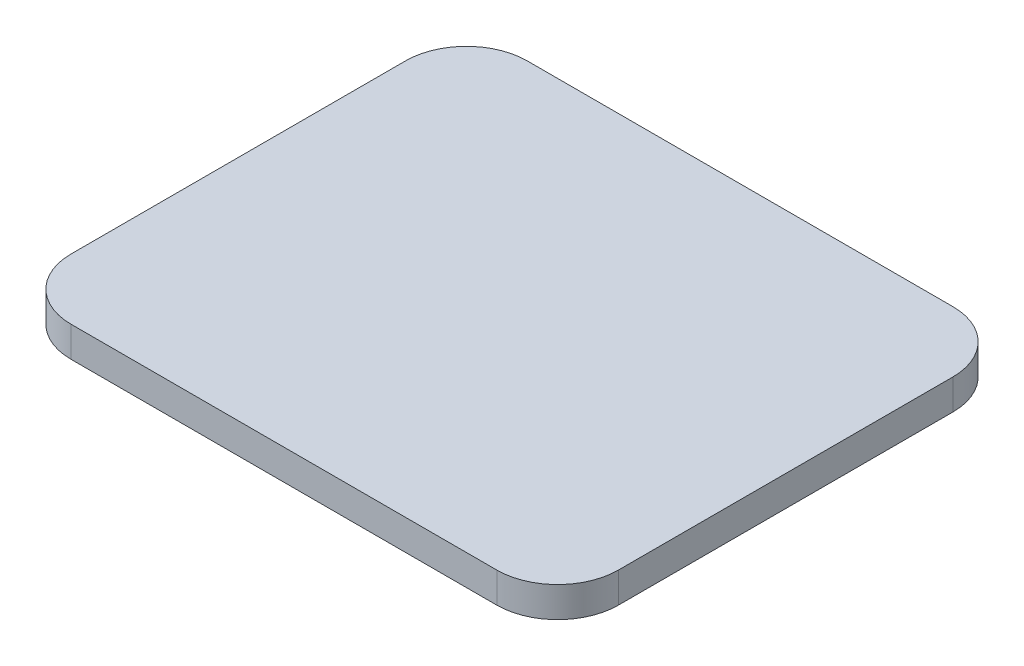
ISO-10303-21;
HEADER;
FILE_DESCRIPTION(('STEP AP214'),'2;1');
FILE_NAME('part.step','',(''),(''),'','','');
FILE_SCHEMA(('AUTOMOTIVE_DESIGN { 1 0 10303 214 1 1 1 1 }'));
ENDSEC;
DATA;
#1=APPLICATION_CONTEXT('core data for automotive mechanical design processes');
#2=APPLICATION_PROTOCOL_DEFINITION('international standard','automotive_design',2000,#1);
#3=PRODUCT_CONTEXT('',#1,'mechanical');
#4=PRODUCT('Part','Part','',(#3));
#5=PRODUCT_RELATED_PRODUCT_CATEGORY('part','',(#4));
#6=PRODUCT_DEFINITION_FORMATION('','',#4);
#7=PRODUCT_DEFINITION_CONTEXT('part definition',#1,'design');
#8=PRODUCT_DEFINITION('design','',#6,#7);
#9=PRODUCT_DEFINITION_SHAPE('','',#8);
#10=(LENGTH_UNIT() NAMED_UNIT(*) SI_UNIT(.MILLI.,.METRE.));
#11=(NAMED_UNIT(*) PLANE_ANGLE_UNIT() SI_UNIT($,.RADIAN.));
#12=(NAMED_UNIT(*) SI_UNIT($,.STERADIAN.) SOLID_ANGLE_UNIT());
#13=UNCERTAINTY_MEASURE_WITH_UNIT(LENGTH_MEASURE(1.E-05),#10,'distance_accuracy_value','');
#14=(GEOMETRIC_REPRESENTATION_CONTEXT(3) GLOBAL_UNCERTAINTY_ASSIGNED_CONTEXT((#13)) GLOBAL_UNIT_ASSIGNED_CONTEXT((#10,
#11,#12)) REPRESENTATION_CONTEXT('',''));
#15=CARTESIAN_POINT('',(0.,0.,0.));
#16=DIRECTION('',(0.,0.,1.));
#17=DIRECTION('',(1.,0.,0.));
#18=AXIS2_PLACEMENT_3D('',#15,#16,#17);
#19=CARTESIAN_POINT('',(2.,1.,-13.));
#20=DIRECTION('',(0.,-1.,0.));
#21=DIRECTION('',(0.,0.,-1.));
#22=AXIS2_PLACEMENT_3D('',#19,#20,#21);
#23=CYLINDRICAL_SURFACE('',#22,2.);
#24=CARTESIAN_POINT('',(2.,0.,-13.));
#25=DIRECTION('',(0.,1.,0.));
#26=DIRECTION('',(0.,0.,1.));
#27=AXIS2_PLACEMENT_3D('',#24,#25,#26);
#28=CIRCLE('',#27,2.);
#29=CARTESIAN_POINT('',(2.00000000000001,0.,-15.));
#30=VERTEX_POINT('',#29);
#31=CARTESIAN_POINT('',(0.,0.,-13.));
#32=VERTEX_POINT('',#31);
#33=EDGE_CURVE('E134',#30,#32,#28,.T.);
#34=ORIENTED_EDGE('',*,*,#33,.T.);
#35=DIRECTION('',(0.,-1.,0.));
#36=VECTOR('',#35,1.);
#37=CARTESIAN_POINT('',(0.,1.,-13.));
#38=LINE('',#37,#36);
#39=CARTESIAN_POINT('',(0.,1.,-13.));
#40=VERTEX_POINT('',#39);
#41=EDGE_CURVE('E11',#40,#32,#38,.T.);
#42=ORIENTED_EDGE('',*,*,#41,.F.);
#43=CARTESIAN_POINT('',(2.,1.,-13.));
#44=DIRECTION('',(0.,1.,0.));
#45=DIRECTION('',(0.,0.,1.));
#46=AXIS2_PLACEMENT_3D('',#43,#44,#45);
#47=CIRCLE('',#46,2.);
#48=CARTESIAN_POINT('',(2.00000000000001,1.,-15.));
#49=VERTEX_POINT('',#48);
#50=EDGE_CURVE('E146',#49,#40,#47,.T.);
#51=ORIENTED_EDGE('',*,*,#50,.F.);
#52=DIRECTION('',(0.,-1.,0.));
#53=VECTOR('',#52,1.);
#54=CARTESIAN_POINT('',(2.00000000000001,1.,-15.));
#55=LINE('',#54,#53);
#56=EDGE_CURVE('E131',#49,#30,#55,.T.);
#57=ORIENTED_EDGE('',*,*,#56,.T.);
#58=EDGE_LOOP('',(#34,#42,#51,#57));
#59=FACE_BOUND('',#58,.T.);
#60=ADVANCED_FACE('F39',(#59),#23,.T.);
#61=CARTESIAN_POINT('',(0.,1.,-2.00000000000001));
#62=DIRECTION('',(1.,0.,0.));
#63=DIRECTION('',(0.,0.,-1.));
#64=AXIS2_PLACEMENT_3D('',#61,#62,#63);
#65=PLANE('',#64);
#66=DIRECTION('',(0.,0.,1.));
#67=VECTOR('',#66,1.);
#68=CARTESIAN_POINT('',(0.,0.,-2.00000000000001));
#69=LINE('',#68,#67);
#70=CARTESIAN_POINT('',(0.,0.,-2.00000000000001));
#71=VERTEX_POINT('',#70);
#72=EDGE_CURVE('E138',#32,#71,#69,.T.);
#73=ORIENTED_EDGE('',*,*,#72,.T.);
#74=DIRECTION('',(0.,-1.,0.));
#75=VECTOR('',#74,1.);
#76=CARTESIAN_POINT('',(0.,1.,-2.00000000000001));
#77=LINE('',#76,#75);
#78=CARTESIAN_POINT('',(0.,1.,-2.00000000000001));
#79=VERTEX_POINT('',#78);
#80=EDGE_CURVE('E50',#79,#71,#77,.T.);
#81=ORIENTED_EDGE('',*,*,#80,.F.);
#82=DIRECTION('',(0.,0.,1.));
#83=VECTOR('',#82,1.);
#84=CARTESIAN_POINT('',(0.,1.,-2.00000000000001));
#85=LINE('',#84,#83);
#86=EDGE_CURVE('E97',#40,#79,#85,.T.);
#87=ORIENTED_EDGE('',*,*,#86,.F.);
#88=ORIENTED_EDGE('',*,*,#41,.T.);
#89=EDGE_LOOP('',(#73,#81,#87,#88));
#90=FACE_BOUND('',#89,.T.);
#91=ADVANCED_FACE('F182',(#90),#65,.F.);
#92=CARTESIAN_POINT('',(2.,1.,-2.));
#93=DIRECTION('',(0.,-1.,0.));
#94=DIRECTION('',(0.,0.,-1.));
#95=AXIS2_PLACEMENT_3D('',#92,#93,#94);
#96=CYLINDRICAL_SURFACE('',#95,2.);
#97=CARTESIAN_POINT('',(2.,0.,-2.));
#98=DIRECTION('',(0.,1.,0.));
#99=DIRECTION('',(0.,0.,1.));
#100=AXIS2_PLACEMENT_3D('',#97,#98,#99);
#101=CIRCLE('',#100,2.);
#102=CARTESIAN_POINT('',(2.00000000000001,0.,0.));
#103=VERTEX_POINT('',#102);
#104=EDGE_CURVE('E139',#71,#103,#101,.T.);
#105=ORIENTED_EDGE('',*,*,#104,.T.);
#106=DIRECTION('',(0.,-1.,0.));
#107=VECTOR('',#106,1.);
#108=CARTESIAN_POINT('',(2.00000000000001,1.,0.));
#109=LINE('',#108,#107);
#110=CARTESIAN_POINT('',(2.00000000000001,1.,0.));
#111=VERTEX_POINT('',#110);
#112=EDGE_CURVE('E157',#111,#103,#109,.T.);
#113=ORIENTED_EDGE('',*,*,#112,.F.);
#114=CARTESIAN_POINT('',(2.,1.,-2.));
#115=DIRECTION('',(0.,1.,0.));
#116=DIRECTION('',(0.,0.,1.));
#117=AXIS2_PLACEMENT_3D('',#114,#115,#116);
#118=CIRCLE('',#117,2.);
#119=EDGE_CURVE('E162',#79,#111,#118,.T.);
#120=ORIENTED_EDGE('',*,*,#119,.F.);
#121=ORIENTED_EDGE('',*,*,#80,.T.);
#122=EDGE_LOOP('',(#105,#113,#120,#121));
#123=FACE_BOUND('',#122,.T.);
#124=ADVANCED_FACE('F165',(#123),#96,.T.);
#125=CARTESIAN_POINT('',(2.00000000000001,1.,0.));
#126=DIRECTION('',(0.,0.,-1.));
#127=DIRECTION('',(-1.,0.,0.));
#128=AXIS2_PLACEMENT_3D('',#125,#126,#127);
#129=PLANE('',#128);
#130=DIRECTION('',(1.,0.,0.));
#131=VECTOR('',#130,1.);
#132=CARTESIAN_POINT('',(2.00000000000001,0.,0.));
#133=LINE('',#132,#131);
#134=CARTESIAN_POINT('',(16.,0.,0.));
#135=VERTEX_POINT('',#134);
#136=EDGE_CURVE('E145',#103,#135,#133,.T.);
#137=ORIENTED_EDGE('',*,*,#136,.T.);
#138=DIRECTION('',(0.,-1.,0.));
#139=VECTOR('',#138,1.);
#140=CARTESIAN_POINT('',(16.,1.,0.));
#141=LINE('',#140,#139);
#142=CARTESIAN_POINT('',(16.,1.,0.));
#143=VERTEX_POINT('',#142);
#144=EDGE_CURVE('E151',#143,#135,#141,.T.);
#145=ORIENTED_EDGE('',*,*,#144,.F.);
#146=DIRECTION('',(1.,0.,0.));
#147=VECTOR('',#146,1.);
#148=CARTESIAN_POINT('',(2.00000000000001,1.,0.));
#149=LINE('',#148,#147);
#150=EDGE_CURVE('E176',#111,#143,#149,.T.);
#151=ORIENTED_EDGE('',*,*,#150,.F.);
#152=ORIENTED_EDGE('',*,*,#112,.T.);
#153=EDGE_LOOP('',(#137,#145,#151,#152));
#154=FACE_BOUND('',#153,.T.);
#155=ADVANCED_FACE('F175',(#154),#129,.F.);
#156=CARTESIAN_POINT('',(16.,1.,-2.));
#157=DIRECTION('',(0.,-1.,0.));
#158=DIRECTION('',(0.,0.,-1.));
#159=AXIS2_PLACEMENT_3D('',#156,#157,#158);
#160=CYLINDRICAL_SURFACE('',#159,2.);
#161=CARTESIAN_POINT('',(16.,0.,-2.));
#162=DIRECTION('',(0.,1.,0.));
#163=DIRECTION('',(0.,0.,1.));
#164=AXIS2_PLACEMENT_3D('',#161,#162,#163);
#165=CIRCLE('',#164,2.);
#166=CARTESIAN_POINT('',(18.,0.,-2.00000000000001));
#167=VERTEX_POINT('',#166);
#168=EDGE_CURVE('E143',#135,#167,#165,.T.);
#169=ORIENTED_EDGE('',*,*,#168,.T.);
#170=DIRECTION('',(0.,-1.,0.));
#171=VECTOR('',#170,1.);
#172=CARTESIAN_POINT('',(18.,1.,-2.00000000000001));
#173=LINE('',#172,#171);
#174=CARTESIAN_POINT('',(18.,1.,-2.00000000000001));
#175=VERTEX_POINT('',#174);
#176=EDGE_CURVE('E128',#175,#167,#173,.T.);
#177=ORIENTED_EDGE('',*,*,#176,.F.);
#178=CARTESIAN_POINT('',(16.,1.,-2.));
#179=DIRECTION('',(0.,1.,0.));
#180=DIRECTION('',(0.,0.,1.));
#181=AXIS2_PLACEMENT_3D('',#178,#179,#180);
#182=CIRCLE('',#181,2.);
#183=EDGE_CURVE('E120',#143,#175,#182,.T.);
#184=ORIENTED_EDGE('',*,*,#183,.F.);
#185=ORIENTED_EDGE('',*,*,#144,.T.);
#186=EDGE_LOOP('',(#169,#177,#184,#185));
#187=FACE_BOUND('',#186,.T.);
#188=ADVANCED_FACE('F172',(#187),#160,.T.);
#189=CARTESIAN_POINT('',(18.,1.,-2.00000000000001));
#190=DIRECTION('',(-1.,0.,0.));
#191=DIRECTION('',(0.,0.,1.));
#192=AXIS2_PLACEMENT_3D('',#189,#190,#191);
#193=PLANE('',#192);
#194=DIRECTION('',(0.,0.,-1.));
#195=VECTOR('',#194,1.);
#196=CARTESIAN_POINT('',(18.,0.,-2.00000000000001));
#197=LINE('',#196,#195);
#198=CARTESIAN_POINT('',(18.,0.,-13.));
#199=VERTEX_POINT('',#198);
#200=EDGE_CURVE('E124',#167,#199,#197,.T.);
#201=ORIENTED_EDGE('',*,*,#200,.T.);
#202=DIRECTION('',(0.,-1.,0.));
#203=VECTOR('',#202,1.);
#204=CARTESIAN_POINT('',(18.,1.,-13.));
#205=LINE('',#204,#203);
#206=CARTESIAN_POINT('',(18.,1.,-13.));
#207=VERTEX_POINT('',#206);
#208=EDGE_CURVE('E122',#207,#199,#205,.T.);
#209=ORIENTED_EDGE('',*,*,#208,.F.);
#210=DIRECTION('',(0.,0.,-1.));
#211=VECTOR('',#210,1.);
#212=CARTESIAN_POINT('',(18.,1.,-2.00000000000001));
#213=LINE('',#212,#211);
#214=EDGE_CURVE('E112',#175,#207,#213,.T.);
#215=ORIENTED_EDGE('',*,*,#214,.F.);
#216=ORIENTED_EDGE('',*,*,#176,.T.);
#217=EDGE_LOOP('',(#201,#209,#215,#216));
#218=FACE_BOUND('',#217,.T.);
#219=ADVANCED_FACE('F121',(#218),#193,.F.);
#220=CARTESIAN_POINT('',(16.,1.,-13.));
#221=DIRECTION('',(0.,-1.,0.));
#222=DIRECTION('',(0.,0.,-1.));
#223=AXIS2_PLACEMENT_3D('',#220,#221,#222);
#224=CYLINDRICAL_SURFACE('',#223,2.);
#225=CARTESIAN_POINT('',(16.,0.,-13.));
#226=DIRECTION('',(0.,1.,0.));
#227=DIRECTION('',(0.,0.,1.));
#228=AXIS2_PLACEMENT_3D('',#225,#226,#227);
#229=CIRCLE('',#228,2.);
#230=CARTESIAN_POINT('',(16.,0.,-15.));
#231=VERTEX_POINT('',#230);
#232=EDGE_CURVE('E84',#199,#231,#229,.T.);
#233=ORIENTED_EDGE('',*,*,#232,.T.);
#234=DIRECTION('',(0.,-1.,0.));
#235=VECTOR('',#234,1.);
#236=CARTESIAN_POINT('',(16.,1.,-15.));
#237=LINE('',#236,#235);
#238=CARTESIAN_POINT('',(16.,1.,-15.));
#239=VERTEX_POINT('',#238);
#240=EDGE_CURVE('E130',#239,#231,#237,.T.);
#241=ORIENTED_EDGE('',*,*,#240,.F.);
#242=CARTESIAN_POINT('',(16.,1.,-13.));
#243=DIRECTION('',(0.,1.,0.));
#244=DIRECTION('',(0.,0.,1.));
#245=AXIS2_PLACEMENT_3D('',#242,#243,#244);
#246=CIRCLE('',#245,2.);
#247=EDGE_CURVE('E113',#207,#239,#246,.T.);
#248=ORIENTED_EDGE('',*,*,#247,.F.);
#249=ORIENTED_EDGE('',*,*,#208,.T.);
#250=EDGE_LOOP('',(#233,#241,#248,#249));
#251=FACE_BOUND('',#250,.T.);
#252=ADVANCED_FACE('F129',(#251),#224,.T.);
#253=CARTESIAN_POINT('',(2.00000000000001,1.,-15.));
#254=DIRECTION('',(0.,0.,1.));
#255=DIRECTION('',(1.,0.,0.));
#256=AXIS2_PLACEMENT_3D('',#253,#254,#255);
#257=PLANE('',#256);
#258=DIRECTION('',(-1.,0.,0.));
#259=VECTOR('',#258,1.);
#260=CARTESIAN_POINT('',(2.00000000000001,0.,-15.));
#261=LINE('',#260,#259);
#262=EDGE_CURVE('E89',#231,#30,#261,.T.);
#263=ORIENTED_EDGE('',*,*,#262,.T.);
#264=ORIENTED_EDGE('',*,*,#56,.F.);
#265=DIRECTION('',(-1.,0.,0.));
#266=VECTOR('',#265,1.);
#267=CARTESIAN_POINT('',(2.00000000000001,1.,-15.));
#268=LINE('',#267,#266);
#269=EDGE_CURVE('E54',#239,#49,#268,.T.);
#270=ORIENTED_EDGE('',*,*,#269,.F.);
#271=ORIENTED_EDGE('',*,*,#240,.T.);
#272=EDGE_LOOP('',(#263,#264,#270,#271));
#273=FACE_BOUND('',#272,.T.);
#274=ADVANCED_FACE('F199',(#273),#257,.F.);
#275=CARTESIAN_POINT('',(2.,1.,-13.));
#276=DIRECTION('',(0.,1.,0.));
#277=DIRECTION('',(0.,0.,1.));
#278=AXIS2_PLACEMENT_3D('',#275,#276,#277);
#279=PLANE('',#278);
#280=ORIENTED_EDGE('',*,*,#50,.T.);
#281=ORIENTED_EDGE('',*,*,#86,.T.);
#282=ORIENTED_EDGE('',*,*,#119,.T.);
#283=ORIENTED_EDGE('',*,*,#150,.T.);
#284=ORIENTED_EDGE('',*,*,#183,.T.);
#285=ORIENTED_EDGE('',*,*,#214,.T.);
#286=ORIENTED_EDGE('',*,*,#247,.T.);
#287=ORIENTED_EDGE('',*,*,#269,.T.);
#288=EDGE_LOOP('',(#280,#281,#282,#283,#284,#285,#286,#287));
#289=FACE_BOUND('',#288,.T.);
#290=ADVANCED_FACE('F111',(#289),#279,.T.);
#291=CARTESIAN_POINT('',(2.,0.,-13.));
#292=DIRECTION('',(0.,1.,0.));
#293=DIRECTION('',(0.,0.,1.));
#294=AXIS2_PLACEMENT_3D('',#291,#292,#293);
#295=PLANE('',#294);
#296=ORIENTED_EDGE('',*,*,#33,.F.);
#297=ORIENTED_EDGE('',*,*,#262,.F.);
#298=ORIENTED_EDGE('',*,*,#232,.F.);
#299=ORIENTED_EDGE('',*,*,#200,.F.);
#300=ORIENTED_EDGE('',*,*,#168,.F.);
#301=ORIENTED_EDGE('',*,*,#136,.F.);
#302=ORIENTED_EDGE('',*,*,#104,.F.);
#303=ORIENTED_EDGE('',*,*,#72,.F.);
#304=EDGE_LOOP('',(#296,#297,#298,#299,#300,#301,#302,#303));
#305=FACE_BOUND('',#304,.T.);
#306=ADVANCED_FACE('F166',(#305),#295,.F.);
#307=CLOSED_SHELL('',(#60,#91,#124,#155,#188,#219,#252,#274,#290,#306));
#308=MANIFOLD_SOLID_BREP('B2',#307);
#309=ADVANCED_BREP_SHAPE_REPRESENTATION('',(#18,#308),#14);
#310=SHAPE_DEFINITION_REPRESENTATION(#9,#309);
ENDSEC;
END-ISO-10303-21;
